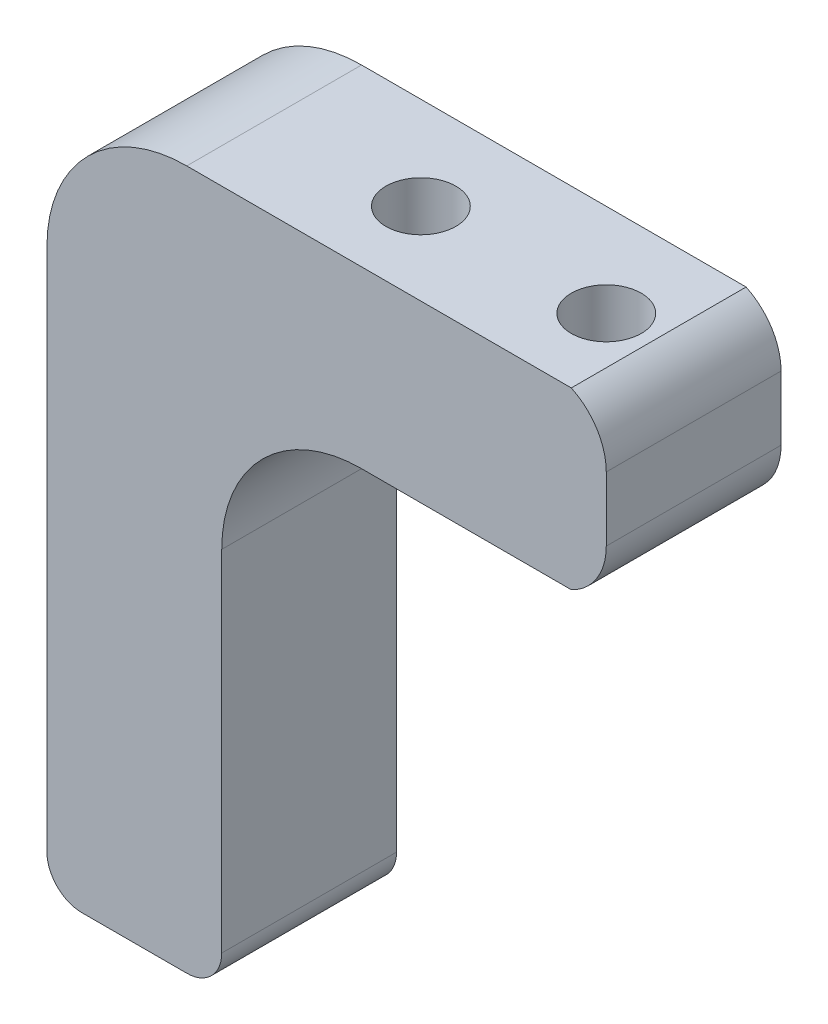
ISO-10303-21;
HEADER;
FILE_DESCRIPTION(('STEP AP214'),'2;1');
FILE_NAME('part.step','',(''),(''),'','','');
FILE_SCHEMA(('AUTOMOTIVE_DESIGN { 1 0 10303 214 1 1 1 1 }'));
ENDSEC;
DATA;
#1=APPLICATION_CONTEXT('core data for automotive mechanical design processes');
#2=APPLICATION_PROTOCOL_DEFINITION('international standard','automotive_design',2000,#1);
#3=PRODUCT_CONTEXT('',#1,'mechanical');
#4=PRODUCT('Part','Part','',(#3));
#5=PRODUCT_RELATED_PRODUCT_CATEGORY('part','',(#4));
#6=PRODUCT_DEFINITION_FORMATION('','',#4);
#7=PRODUCT_DEFINITION_CONTEXT('part definition',#1,'design');
#8=PRODUCT_DEFINITION('design','',#6,#7);
#9=PRODUCT_DEFINITION_SHAPE('','',#8);
#10=(LENGTH_UNIT() NAMED_UNIT(*) SI_UNIT(.MILLI.,.METRE.));
#11=(NAMED_UNIT(*) PLANE_ANGLE_UNIT() SI_UNIT($,.RADIAN.));
#12=(NAMED_UNIT(*) SI_UNIT($,.STERADIAN.) SOLID_ANGLE_UNIT());
#13=UNCERTAINTY_MEASURE_WITH_UNIT(LENGTH_MEASURE(1.E-05),#10,'distance_accuracy_value','');
#14=(GEOMETRIC_REPRESENTATION_CONTEXT(3) GLOBAL_UNCERTAINTY_ASSIGNED_CONTEXT((#13)) GLOBAL_UNIT_ASSIGNED_CONTEXT((#10,
#11,#12)) REPRESENTATION_CONTEXT('',''));
#15=CARTESIAN_POINT('',(0.,0.,0.));
#16=DIRECTION('',(0.,0.,1.));
#17=DIRECTION('',(1.,0.,0.));
#18=AXIS2_PLACEMENT_3D('',#15,#16,#17);
#19=CARTESIAN_POINT('',(18.,22.,10.));
#20=DIRECTION('',(0.,0.,-1.));
#21=DIRECTION('',(-1.,0.,0.));
#22=AXIS2_PLACEMENT_3D('',#19,#20,#21);
#23=CYLINDRICAL_SURFACE('',#22,8.);
#24=DIRECTION('',(0.,0.,-1.));
#25=VECTOR('',#24,1.);
#26=CARTESIAN_POINT('',(18.,30.,10.));
#27=LINE('',#26,#25);
#28=CARTESIAN_POINT('',(18.,30.,3.78626200930005));
#29=VERTEX_POINT('',#28);
#30=CARTESIAN_POINT('',(18.,30.,0.));
#31=VERTEX_POINT('',#30);
#32=EDGE_CURVE('E43',#29,#31,#27,.T.);
#33=ORIENTED_EDGE('',*,*,#32,.F.);
#34=CARTESIAN_POINT('',(18.,30.,3.78626200930005));
#35=CARTESIAN_POINT('',(17.9581541375709,30.0000004037782,3.75031199015781));
#36=CARTESIAN_POINT('',(17.9148387786763,29.999671171087,3.7161106534324));
#37=CARTESIAN_POINT('',(17.8255410886128,29.9982223586818,3.65140516871878));
#38=CARTESIAN_POINT('',(17.7795587091345,29.9971027646475,3.62090108773233));
#39=CARTESIAN_POINT('',(17.6381868953076,29.992367378446,3.53533647613063));
#40=CARTESIAN_POINT('',(17.5392241095997,29.9873758972322,3.48609612306307));
#41=CARTESIAN_POINT('',(17.3347898304661,29.9729547824848,3.40462382730165));
#42=CARTESIAN_POINT('',(17.2293129317956,29.9635214190063,3.37240622732398));
#43=CARTESIAN_POINT('',(17.0150460107856,29.939865783288,3.32576025856803));
#44=CARTESIAN_POINT('',(16.9062571033056,29.9256451066492,3.31132597011048));
#45=CARTESIAN_POINT('',(16.688740021005,29.8925710129595,3.30035923563493));
#46=CARTESIAN_POINT('',(16.5800122092576,29.8737275149771,3.30378877430427));
#47=CARTESIAN_POINT('',(16.3652886146513,29.831966132583,3.3279911018635));
#48=CARTESIAN_POINT('',(16.2592938560138,29.8090467454139,3.34877029795129));
#49=CARTESIAN_POINT('',(16.049513590354,29.7593542083131,3.40767900936154));
#50=CARTESIAN_POINT('',(15.9458948850881,29.7324846083008,3.44631989408963));
#51=CARTESIAN_POINT('',(15.7468164407634,29.6768393315936,3.53983103960354));
#52=CARTESIAN_POINT('',(15.6513584295301,29.6480632535269,3.59470472636909));
#53=CARTESIAN_POINT('',(15.4665700824969,29.5889114266981,3.72217620160287));
#54=CARTESIAN_POINT('',(15.3777269994036,29.558523222656,3.79547606146828));
#55=CARTESIAN_POINT('',(15.2135846844632,29.4995673171941,3.95660105558493));
#56=CARTESIAN_POINT('',(15.1382884534343,29.4710000200335,4.04442939984962));
#57=CARTESIAN_POINT('',(15.0031768712859,29.4178404880318,4.23302392001163));
#58=CARTESIAN_POINT('',(14.9434318052278,29.3932664828079,4.33384585784817));
#59=CARTESIAN_POINT('',(14.8421183334829,29.3505665641479,4.54549450198683));
#60=CARTESIAN_POINT('',(14.8005387536385,29.3324366880102,4.6563150070911));
#61=CARTESIAN_POINT('',(14.7395738536877,29.3055228372001,4.87685631484133));
#62=CARTESIAN_POINT('',(14.7188821591376,29.296191571644,4.98614833399039));
#63=CARTESIAN_POINT('',(14.6959393056221,29.2858324184091,5.20702077451085));
#64=CARTESIAN_POINT('',(14.6936790749875,29.2848004459556,5.31860004302092));
#65=CARTESIAN_POINT('',(14.7071963718525,29.290917639894,5.53258165738326));
#66=CARTESIAN_POINT('',(14.7217292984717,29.2975023428105,5.63508216553269));
#67=CARTESIAN_POINT('',(14.7662024119615,29.3173177596113,5.83600255222788));
#68=CARTESIAN_POINT('',(14.7961438220682,29.3305490011436,5.93442210612775));
#69=CARTESIAN_POINT('',(14.8707942613189,29.3627258794326,6.12596648622863));
#70=CARTESIAN_POINT('',(14.9156898124323,29.3817434148468,6.21900607084032));
#71=CARTESIAN_POINT('',(15.018706605471,29.4239464772951,6.39640278262671));
#72=CARTESIAN_POINT('',(15.0768321020974,29.4471333446658,6.48075710395059));
#73=CARTESIAN_POINT('',(15.2097287041767,29.4979875498677,6.64529335162734));
#74=CARTESIAN_POINT('',(15.2854363698244,29.5258623467681,6.72465503824281));
#75=CARTESIAN_POINT('',(15.4485408958203,29.5827115290047,6.86983554330948));
#76=CARTESIAN_POINT('',(15.5359418259841,29.6116862946562,6.93564962620822));
#77=CARTESIAN_POINT('',(15.7259158697739,29.6706576976109,7.05570841181866));
#78=CARTESIAN_POINT('',(15.8290796955629,29.7006138647113,7.10904223344067));
#79=CARTESIAN_POINT('',(16.0437124936357,29.7579163269707,7.19725637877539));
#80=CARTESIAN_POINT('',(16.1551815299021,29.7852626020196,7.23213656030598));
#81=CARTESIAN_POINT('',(16.3823000137539,29.8355878030593,7.28181821188559));
#82=CARTESIAN_POINT('',(16.4978986796708,29.8586063640472,7.29681037852287));
#83=CARTESIAN_POINT('',(16.7308209392879,29.8995662794725,7.3064000202226));
#84=CARTESIAN_POINT('',(16.84814384082,29.917509615714,7.30100546786239));
#85=CARTESIAN_POINT('',(17.0752384416548,29.9471582761392,7.27033414517417));
#86=CARTESIAN_POINT('',(17.1851058238742,29.959117225013,7.24600409145888));
#87=CARTESIAN_POINT('',(17.399580070966,29.9781625310022,7.17908343032399));
#88=CARTESIAN_POINT('',(17.5041887147987,29.9852505463103,7.13649904517897));
#89=CARTESIAN_POINT('',(17.6753883269194,29.9937279971999,7.04929884771132));
#90=CARTESIAN_POINT('',(17.7441343975952,29.9961788514745,7.00893815896909));
#91=CARTESIAN_POINT('',(17.8762802178445,29.9993178541506,6.92037302840992));
#92=CARTESIAN_POINT('',(17.9396871955432,30.0000084239907,6.87217945871357));
#93=CARTESIAN_POINT('',(18.,30.,6.8203397084982));
#94=B_SPLINE_CURVE_WITH_KNOTS('',3,(#34,#35,#36,#37,#38,#39,#40,#41,#42,#43,#44,#45,#46,#47,#48,
#49,#50,#51,#52,#53,#54,#55,#56,#57,#58,#59,#60,#61,#62,#63,#64,#65,#66,#67,#68,#69,#70,#71,#72,
#73,#74,#75,#76,#77,#78,#79,#80,#81,#82,#83,#84,#85,#86,#87,#88,#89,#90,#91,#92,#93),
.UNSPECIFIED.,.F.,.F.,(4,2,2,2,2,2,2,2,2,2,2,2,2,2,2,2,2,2,2,2,2,2,2,2,2,2,2,2,2,4),(0.,
0.165404618031273,0.330812233080998,0.661047411420463,0.991560391283093,1.32196332078026,
1.65166342034593,1.98148533145803,2.32139787396724,2.66138220724431,3.01708301990866,
3.37286252854663,3.73022314325104,4.08736362371171,4.4204464535295,4.75336533545012,
5.06311077462391,5.37288080741128,5.68666906059636,6.00055836985133,6.33859572442004,
6.67675103973497,7.03484333027455,7.39293837981335,7.74757439540581,8.10207173883505,
8.43990186874776,8.77761693542808,9.01633033375412,9.25471518146875),.UNSPECIFIED.);
#95=CARTESIAN_POINT('',(18.,30.,6.8203397084982));
#96=VERTEX_POINT('',#95);
#97=EDGE_CURVE('E57',#29,#96,#94,.T.);
#98=ORIENTED_EDGE('',*,*,#97,.T.);
#99=CARTESIAN_POINT('',(18.,30.,10.));
#100=VERTEX_POINT('',#99);
#101=EDGE_CURVE('E11',#100,#96,#27,.T.);
#102=ORIENTED_EDGE('',*,*,#101,.F.);
#103=CARTESIAN_POINT('',(18.,22.,10.));
#104=DIRECTION('',(0.,0.,-1.));
#105=DIRECTION('',(1.,0.,0.));
#106=AXIS2_PLACEMENT_3D('',#103,#104,#105);
#107=CIRCLE('',#106,8.);
#108=CARTESIAN_POINT('',(10.,22.,10.));
#109=VERTEX_POINT('',#108);
#110=EDGE_CURVE('E171',#109,#100,#107,.T.);
#111=ORIENTED_EDGE('',*,*,#110,.F.);
#112=DIRECTION('',(0.,0.,-1.));
#113=VECTOR('',#112,1.);
#114=CARTESIAN_POINT('',(10.,22.,10.));
#115=LINE('',#114,#113);
#116=CARTESIAN_POINT('',(10.,22.,0.));
#117=VERTEX_POINT('',#116);
#118=EDGE_CURVE('E172',#109,#117,#115,.T.);
#119=ORIENTED_EDGE('',*,*,#118,.T.);
#120=CARTESIAN_POINT('',(18.,22.,0.));
#121=DIRECTION('',(0.,0.,-1.));
#122=DIRECTION('',(1.,0.,0.));
#123=AXIS2_PLACEMENT_3D('',#120,#121,#122);
#124=CIRCLE('',#123,8.);
#125=EDGE_CURVE('E158',#117,#31,#124,.T.);
#126=ORIENTED_EDGE('',*,*,#125,.T.);
#127=EDGE_LOOP('',(#33,#98,#102,#111,#119,#126));
#128=FACE_BOUND('',#127,.T.);
#129=ADVANCED_FACE('F35',(#128),#23,.F.);
#130=CARTESIAN_POINT('',(18.,30.,10.));
#131=DIRECTION('',(0.,1.,0.));
#132=DIRECTION('',(-1.,0.,0.));
#133=AXIS2_PLACEMENT_3D('',#130,#131,#132);
#134=PLANE('',#133);
#135=CARTESIAN_POINT('',(27.3033008588991,30.,5.30330085889912));
#136=DIRECTION('',(0.,1.,0.));
#137=DIRECTION('',(-1.,0.,0.));
#138=AXIS2_PLACEMENT_3D('',#135,#136,#137);
#139=CIRCLE('',#138,2.00000000000002);
#140=CARTESIAN_POINT('',(25.3033008588991,30.,5.30330085889912));
#141=VERTEX_POINT('',#140);
#142=EDGE_CURVE('E282',#141,#141,#139,.T.);
#143=ORIENTED_EDGE('',*,*,#142,.T.);
#144=EDGE_LOOP('',(#143));
#145=FACE_BOUND('',#144,.T.);
#146=DIRECTION('',(1.,0.,0.));
#147=VECTOR('',#146,1.);
#148=CARTESIAN_POINT('',(18.,30.,0.));
#149=LINE('',#148,#147);
#150=CARTESIAN_POINT('',(30.,30.,0.));
#151=VERTEX_POINT('',#150);
#152=EDGE_CURVE('E153',#31,#151,#149,.T.);
#153=ORIENTED_EDGE('',*,*,#152,.T.);
#154=DIRECTION('',(0.,0.,1.));
#155=VECTOR('',#154,1.);
#156=CARTESIAN_POINT('',(30.,30.,0.));
#157=LINE('',#156,#155);
#158=CARTESIAN_POINT('',(30.,30.,10.));
#159=VERTEX_POINT('',#158);
#160=EDGE_CURVE('E290',#151,#159,#157,.T.);
#161=ORIENTED_EDGE('',*,*,#160,.T.);
#162=DIRECTION('',(1.,0.,0.));
#163=VECTOR('',#162,1.);
#164=CARTESIAN_POINT('',(18.,30.,10.));
#165=LINE('',#164,#163);
#166=EDGE_CURVE('E221',#100,#159,#165,.T.);
#167=ORIENTED_EDGE('',*,*,#166,.F.);
#168=ORIENTED_EDGE('',*,*,#101,.T.);
#169=CARTESIAN_POINT('',(16.6966991411009,30.,5.30330085889912));
#170=DIRECTION('',(0.,1.,0.));
#171=DIRECTION('',(-1.,0.,0.));
#172=AXIS2_PLACEMENT_3D('',#169,#170,#171);
#173=CIRCLE('',#172,2.);
#174=EDGE_CURVE('E198',#96,#29,#173,.T.);
#175=ORIENTED_EDGE('',*,*,#174,.T.);
#176=ORIENTED_EDGE('',*,*,#32,.T.);
#177=EDGE_LOOP('',(#153,#161,#167,#168,#175,#176));
#178=FACE_BOUND('',#177,.T.);
#179=ADVANCED_FACE('F196',(#145,#178),#134,.F.);
#180=CARTESIAN_POINT('',(8.,40.,10.));
#181=DIRECTION('',(0.,-1.,0.));
#182=DIRECTION('',(1.,0.,0.));
#183=AXIS2_PLACEMENT_3D('',#180,#181,#182);
#184=PLANE('',#183);
#185=CARTESIAN_POINT('',(16.6966991411009,40.,5.30330085889912));
#186=DIRECTION('',(0.,1.,0.));
#187=DIRECTION('',(-1.,0.,0.));
#188=AXIS2_PLACEMENT_3D('',#185,#186,#187);
#189=CIRCLE('',#188,2.);
#190=CARTESIAN_POINT('',(14.6966991411009,40.,5.30330085889912));
#191=VERTEX_POINT('',#190);
#192=EDGE_CURVE('E284',#191,#191,#189,.T.);
#193=ORIENTED_EDGE('',*,*,#192,.F.);
#194=EDGE_LOOP('',(#193));
#195=FACE_BOUND('',#194,.T.);
#196=CARTESIAN_POINT('',(27.3033008588991,40.,5.30330085889912));
#197=DIRECTION('',(0.,1.,0.));
#198=DIRECTION('',(-1.,0.,0.));
#199=AXIS2_PLACEMENT_3D('',#196,#197,#198);
#200=CIRCLE('',#199,2.00000000000002);
#201=CARTESIAN_POINT('',(25.3033008588991,40.,5.30330085889912));
#202=VERTEX_POINT('',#201);
#203=EDGE_CURVE('E286',#202,#202,#200,.T.);
#204=ORIENTED_EDGE('',*,*,#203,.F.);
#205=EDGE_LOOP('',(#204));
#206=FACE_BOUND('',#205,.T.);
#207=DIRECTION('',(-1.,0.,0.));
#208=VECTOR('',#207,1.);
#209=CARTESIAN_POINT('',(8.,40.,10.));
#210=LINE('',#209,#208);
#211=CARTESIAN_POINT('',(30.,40.,10.));
#212=VERTEX_POINT('',#211);
#213=CARTESIAN_POINT('',(8.,40.,10.));
#214=VERTEX_POINT('',#213);
#215=EDGE_CURVE('E146',#212,#214,#210,.T.);
#216=ORIENTED_EDGE('',*,*,#215,.F.);
#217=DIRECTION('',(0.,0.,1.));
#218=VECTOR('',#217,1.);
#219=CARTESIAN_POINT('',(30.,40.,0.));
#220=LINE('',#219,#218);
#221=CARTESIAN_POINT('',(30.,40.,0.));
#222=VERTEX_POINT('',#221);
#223=EDGE_CURVE('E133',#222,#212,#220,.T.);
#224=ORIENTED_EDGE('',*,*,#223,.F.);
#225=DIRECTION('',(-1.,0.,0.));
#226=VECTOR('',#225,1.);
#227=CARTESIAN_POINT('',(8.,40.,0.));
#228=LINE('',#227,#226);
#229=CARTESIAN_POINT('',(8.,40.,0.));
#230=VERTEX_POINT('',#229);
#231=EDGE_CURVE('E144',#222,#230,#228,.T.);
#232=ORIENTED_EDGE('',*,*,#231,.T.);
#233=DIRECTION('',(0.,0.,-1.));
#234=VECTOR('',#233,1.);
#235=CARTESIAN_POINT('',(8.,40.,10.));
#236=LINE('',#235,#234);
#237=EDGE_CURVE('E190',#214,#230,#236,.T.);
#238=ORIENTED_EDGE('',*,*,#237,.F.);
#239=EDGE_LOOP('',(#216,#224,#232,#238));
#240=FACE_BOUND('',#239,.T.);
#241=ADVANCED_FACE('F142',(#195,#206,#240),#184,.F.);
#242=CARTESIAN_POINT('',(8.,32.,10.));
#243=DIRECTION('',(0.,0.,-1.));
#244=DIRECTION('',(-1.,0.,0.));
#245=AXIS2_PLACEMENT_3D('',#242,#243,#244);
#246=CYLINDRICAL_SURFACE('',#245,8.);
#247=CARTESIAN_POINT('',(8.,32.,0.));
#248=DIRECTION('',(0.,0.,1.));
#249=DIRECTION('',(-1.,0.,0.));
#250=AXIS2_PLACEMENT_3D('',#247,#248,#249);
#251=CIRCLE('',#250,8.);
#252=CARTESIAN_POINT('',(0.,32.,0.));
#253=VERTEX_POINT('',#252);
#254=EDGE_CURVE('E152',#230,#253,#251,.T.);
#255=ORIENTED_EDGE('',*,*,#254,.T.);
#256=DIRECTION('',(0.,0.,-1.));
#257=VECTOR('',#256,1.);
#258=CARTESIAN_POINT('',(0.,32.,10.));
#259=LINE('',#258,#257);
#260=CARTESIAN_POINT('',(0.,32.,10.));
#261=VERTEX_POINT('',#260);
#262=EDGE_CURVE('E188',#261,#253,#259,.T.);
#263=ORIENTED_EDGE('',*,*,#262,.F.);
#264=CARTESIAN_POINT('',(8.,32.,10.));
#265=DIRECTION('',(0.,0.,1.));
#266=DIRECTION('',(-1.,0.,0.));
#267=AXIS2_PLACEMENT_3D('',#264,#265,#266);
#268=CIRCLE('',#267,8.);
#269=EDGE_CURVE('E218',#214,#261,#268,.T.);
#270=ORIENTED_EDGE('',*,*,#269,.F.);
#271=ORIENTED_EDGE('',*,*,#237,.T.);
#272=EDGE_LOOP('',(#255,#263,#270,#271));
#273=FACE_BOUND('',#272,.T.);
#274=ADVANCED_FACE('F269',(#273),#246,.T.);
#275=CARTESIAN_POINT('',(0.,32.,10.));
#276=DIRECTION('',(1.,0.,0.));
#277=DIRECTION('',(0.,1.,0.));
#278=AXIS2_PLACEMENT_3D('',#275,#276,#277);
#279=PLANE('',#278);
#280=DIRECTION('',(0.,-1.,0.));
#281=VECTOR('',#280,1.);
#282=CARTESIAN_POINT('',(0.,32.,0.));
#283=LINE('',#282,#281);
#284=CARTESIAN_POINT('',(0.,2.,0.));
#285=VERTEX_POINT('',#284);
#286=EDGE_CURVE('E155',#253,#285,#283,.T.);
#287=ORIENTED_EDGE('',*,*,#286,.T.);
#288=DIRECTION('',(0.,0.,-1.));
#289=VECTOR('',#288,1.);
#290=CARTESIAN_POINT('',(0.,2.,10.));
#291=LINE('',#290,#289);
#292=CARTESIAN_POINT('',(0.,2.,10.));
#293=VERTEX_POINT('',#292);
#294=EDGE_CURVE('E185',#293,#285,#291,.T.);
#295=ORIENTED_EDGE('',*,*,#294,.F.);
#296=DIRECTION('',(0.,-1.,0.));
#297=VECTOR('',#296,1.);
#298=CARTESIAN_POINT('',(0.,32.,10.));
#299=LINE('',#298,#297);
#300=EDGE_CURVE('E216',#261,#293,#299,.T.);
#301=ORIENTED_EDGE('',*,*,#300,.F.);
#302=ORIENTED_EDGE('',*,*,#262,.T.);
#303=EDGE_LOOP('',(#287,#295,#301,#302));
#304=FACE_BOUND('',#303,.T.);
#305=ADVANCED_FACE('F265',(#304),#279,.F.);
#306=CARTESIAN_POINT('',(2.,2.,10.));
#307=DIRECTION('',(0.,0.,-1.));
#308=DIRECTION('',(-1.,0.,0.));
#309=AXIS2_PLACEMENT_3D('',#306,#307,#308);
#310=CYLINDRICAL_SURFACE('',#309,2.);
#311=CARTESIAN_POINT('',(2.,2.,0.));
#312=DIRECTION('',(0.,0.,1.));
#313=DIRECTION('',(-1.,0.,0.));
#314=AXIS2_PLACEMENT_3D('',#311,#312,#313);
#315=CIRCLE('',#314,2.);
#316=CARTESIAN_POINT('',(2.,0.,0.));
#317=VERTEX_POINT('',#316);
#318=EDGE_CURVE('E163',#285,#317,#315,.T.);
#319=ORIENTED_EDGE('',*,*,#318,.T.);
#320=DIRECTION('',(0.,0.,-1.));
#321=VECTOR('',#320,1.);
#322=CARTESIAN_POINT('',(2.,0.,10.));
#323=LINE('',#322,#321);
#324=CARTESIAN_POINT('',(2.,0.,10.));
#325=VERTEX_POINT('',#324);
#326=EDGE_CURVE('E182',#325,#317,#323,.T.);
#327=ORIENTED_EDGE('',*,*,#326,.F.);
#328=CARTESIAN_POINT('',(2.,2.,10.));
#329=DIRECTION('',(0.,0.,1.));
#330=DIRECTION('',(-1.,0.,0.));
#331=AXIS2_PLACEMENT_3D('',#328,#329,#330);
#332=CIRCLE('',#331,2.);
#333=EDGE_CURVE('E214',#293,#325,#332,.T.);
#334=ORIENTED_EDGE('',*,*,#333,.F.);
#335=ORIENTED_EDGE('',*,*,#294,.T.);
#336=EDGE_LOOP('',(#319,#327,#334,#335));
#337=FACE_BOUND('',#336,.T.);
#338=ADVANCED_FACE('F261',(#337),#310,.T.);
#339=CARTESIAN_POINT('',(2.,0.,10.));
#340=DIRECTION('',(0.,1.,0.));
#341=DIRECTION('',(-1.,0.,0.));
#342=AXIS2_PLACEMENT_3D('',#339,#340,#341);
#343=PLANE('',#342);
#344=DIRECTION('',(1.,0.,0.));
#345=VECTOR('',#344,1.);
#346=CARTESIAN_POINT('',(2.,0.,0.));
#347=LINE('',#346,#345);
#348=CARTESIAN_POINT('',(8.,0.,0.));
#349=VERTEX_POINT('',#348);
#350=EDGE_CURVE('E165',#317,#349,#347,.T.);
#351=ORIENTED_EDGE('',*,*,#350,.T.);
#352=DIRECTION('',(0.,0.,-1.));
#353=VECTOR('',#352,1.);
#354=CARTESIAN_POINT('',(8.,0.,10.));
#355=LINE('',#354,#353);
#356=CARTESIAN_POINT('',(8.,0.,10.));
#357=VERTEX_POINT('',#356);
#358=EDGE_CURVE('E179',#357,#349,#355,.T.);
#359=ORIENTED_EDGE('',*,*,#358,.F.);
#360=DIRECTION('',(1.,0.,0.));
#361=VECTOR('',#360,1.);
#362=CARTESIAN_POINT('',(2.,0.,10.));
#363=LINE('',#362,#361);
#364=EDGE_CURVE('E212',#325,#357,#363,.T.);
#365=ORIENTED_EDGE('',*,*,#364,.F.);
#366=ORIENTED_EDGE('',*,*,#326,.T.);
#367=EDGE_LOOP('',(#351,#359,#365,#366));
#368=FACE_BOUND('',#367,.T.);
#369=ADVANCED_FACE('F257',(#368),#343,.F.);
#370=CARTESIAN_POINT('',(8.,2.,10.));
#371=DIRECTION('',(0.,0.,-1.));
#372=DIRECTION('',(-1.,0.,0.));
#373=AXIS2_PLACEMENT_3D('',#370,#371,#372);
#374=CYLINDRICAL_SURFACE('',#373,2.);
#375=CARTESIAN_POINT('',(8.,2.,0.));
#376=DIRECTION('',(0.,0.,1.));
#377=DIRECTION('',(1.,0.,0.));
#378=AXIS2_PLACEMENT_3D('',#375,#376,#377);
#379=CIRCLE('',#378,2.);
#380=CARTESIAN_POINT('',(10.,2.,0.));
#381=VERTEX_POINT('',#380);
#382=EDGE_CURVE('E167',#349,#381,#379,.T.);
#383=ORIENTED_EDGE('',*,*,#382,.T.);
#384=DIRECTION('',(0.,0.,-1.));
#385=VECTOR('',#384,1.);
#386=CARTESIAN_POINT('',(10.,2.,10.));
#387=LINE('',#386,#385);
#388=CARTESIAN_POINT('',(10.,2.,10.));
#389=VERTEX_POINT('',#388);
#390=EDGE_CURVE('E175',#389,#381,#387,.T.);
#391=ORIENTED_EDGE('',*,*,#390,.F.);
#392=CARTESIAN_POINT('',(8.,2.,10.));
#393=DIRECTION('',(0.,0.,1.));
#394=DIRECTION('',(1.,0.,0.));
#395=AXIS2_PLACEMENT_3D('',#392,#393,#394);
#396=CIRCLE('',#395,2.);
#397=EDGE_CURVE('E210',#357,#389,#396,.T.);
#398=ORIENTED_EDGE('',*,*,#397,.F.);
#399=ORIENTED_EDGE('',*,*,#358,.T.);
#400=EDGE_LOOP('',(#383,#391,#398,#399));
#401=FACE_BOUND('',#400,.T.);
#402=ADVANCED_FACE('F253',(#401),#374,.T.);
#403=CARTESIAN_POINT('',(10.,2.,10.));
#404=DIRECTION('',(-1.,0.,0.));
#405=DIRECTION('',(0.,-1.,0.));
#406=AXIS2_PLACEMENT_3D('',#403,#404,#405);
#407=PLANE('',#406);
#408=DIRECTION('',(0.,1.,0.));
#409=VECTOR('',#408,1.);
#410=CARTESIAN_POINT('',(10.,2.,0.));
#411=LINE('',#410,#409);
#412=EDGE_CURVE('E169',#381,#117,#411,.T.);
#413=ORIENTED_EDGE('',*,*,#412,.T.);
#414=ORIENTED_EDGE('',*,*,#118,.F.);
#415=DIRECTION('',(0.,1.,0.));
#416=VECTOR('',#415,1.);
#417=CARTESIAN_POINT('',(10.,2.,10.));
#418=LINE('',#417,#416);
#419=EDGE_CURVE('E176',#389,#109,#418,.T.);
#420=ORIENTED_EDGE('',*,*,#419,.F.);
#421=ORIENTED_EDGE('',*,*,#390,.T.);
#422=EDGE_LOOP('',(#413,#414,#420,#421));
#423=FACE_BOUND('',#422,.T.);
#424=ADVANCED_FACE('F247',(#423),#407,.F.);
#425=CARTESIAN_POINT('',(18.,22.,10.));
#426=DIRECTION('',(0.,0.,1.));
#427=DIRECTION('',(1.,0.,0.));
#428=AXIS2_PLACEMENT_3D('',#425,#426,#427);
#429=PLANE('',#428);
#430=CARTESIAN_POINT('',(28.5,33.1622776601684,10.));
#431=DIRECTION('',(0.,0.,-1.));
#432=DIRECTION('',(1.,0.,0.));
#433=AXIS2_PLACEMENT_3D('',#430,#431,#432);
#434=CIRCLE('',#433,3.5);
#435=CARTESIAN_POINT('',(32.,33.1622776601684,10.));
#436=VERTEX_POINT('',#435);
#437=EDGE_CURVE('E138',#436,#159,#434,.T.);
#438=ORIENTED_EDGE('',*,*,#437,.F.);
#439=DIRECTION('',(0.,-1.,0.));
#440=VECTOR('',#439,1.);
#441=CARTESIAN_POINT('',(32.,36.8377223398316,10.));
#442=LINE('',#441,#440);
#443=CARTESIAN_POINT('',(32.,36.8377223398316,10.));
#444=VERTEX_POINT('',#443);
#445=EDGE_CURVE('E297',#444,#436,#442,.T.);
#446=ORIENTED_EDGE('',*,*,#445,.F.);
#447=CARTESIAN_POINT('',(28.5,36.8377223398316,10.));
#448=DIRECTION('',(0.,0.,-1.));
#449=DIRECTION('',(1.,0.,0.));
#450=AXIS2_PLACEMENT_3D('',#447,#448,#449);
#451=CIRCLE('',#450,3.5);
#452=EDGE_CURVE('E300',#212,#444,#451,.T.);
#453=ORIENTED_EDGE('',*,*,#452,.F.);
#454=ORIENTED_EDGE('',*,*,#215,.T.);
#455=ORIENTED_EDGE('',*,*,#269,.T.);
#456=ORIENTED_EDGE('',*,*,#300,.T.);
#457=ORIENTED_EDGE('',*,*,#333,.T.);
#458=ORIENTED_EDGE('',*,*,#364,.T.);
#459=ORIENTED_EDGE('',*,*,#397,.T.);
#460=ORIENTED_EDGE('',*,*,#419,.T.);
#461=ORIENTED_EDGE('',*,*,#110,.T.);
#462=ORIENTED_EDGE('',*,*,#166,.T.);
#463=EDGE_LOOP('',(#438,#446,#453,#454,#455,#456,#457,#458,#459,#460,#461,#462));
#464=FACE_BOUND('',#463,.T.);
#465=ADVANCED_FACE('F244',(#464),#429,.T.);
#466=CARTESIAN_POINT('',(18.,22.,0.));
#467=DIRECTION('',(0.,0.,1.));
#468=DIRECTION('',(1.,0.,0.));
#469=AXIS2_PLACEMENT_3D('',#466,#467,#468);
#470=PLANE('',#469);
#471=DIRECTION('',(0.,-1.,0.));
#472=VECTOR('',#471,1.);
#473=CARTESIAN_POINT('',(32.,36.8377223398316,0.));
#474=LINE('',#473,#472);
#475=CARTESIAN_POINT('',(32.,36.8377223398316,0.));
#476=VERTEX_POINT('',#475);
#477=CARTESIAN_POINT('',(32.,33.1622776601684,0.));
#478=VERTEX_POINT('',#477);
#479=EDGE_CURVE('E50',#476,#478,#474,.T.);
#480=ORIENTED_EDGE('',*,*,#479,.T.);
#481=CARTESIAN_POINT('',(28.5,33.1622776601684,0.));
#482=DIRECTION('',(0.,0.,-1.));
#483=DIRECTION('',(1.,0.,0.));
#484=AXIS2_PLACEMENT_3D('',#481,#482,#483);
#485=CIRCLE('',#484,3.5);
#486=EDGE_CURVE('E147',#478,#151,#485,.T.);
#487=ORIENTED_EDGE('',*,*,#486,.T.);
#488=ORIENTED_EDGE('',*,*,#152,.F.);
#489=ORIENTED_EDGE('',*,*,#125,.F.);
#490=ORIENTED_EDGE('',*,*,#412,.F.);
#491=ORIENTED_EDGE('',*,*,#382,.F.);
#492=ORIENTED_EDGE('',*,*,#350,.F.);
#493=ORIENTED_EDGE('',*,*,#318,.F.);
#494=ORIENTED_EDGE('',*,*,#286,.F.);
#495=ORIENTED_EDGE('',*,*,#254,.F.);
#496=ORIENTED_EDGE('',*,*,#231,.F.);
#497=CARTESIAN_POINT('',(28.5,36.8377223398316,0.));
#498=DIRECTION('',(0.,0.,-1.));
#499=DIRECTION('',(1.,0.,0.));
#500=AXIS2_PLACEMENT_3D('',#497,#498,#499);
#501=CIRCLE('',#500,3.5);
#502=EDGE_CURVE('E129',#222,#476,#501,.T.);
#503=ORIENTED_EDGE('',*,*,#502,.T.);
#504=EDGE_LOOP('',(#480,#487,#488,#489,#490,#491,#492,#493,#494,#495,#496,#503));
#505=FACE_BOUND('',#504,.T.);
#506=ADVANCED_FACE('F150',(#505),#470,.F.);
#507=CARTESIAN_POINT('',(27.3033008588991,9.99999999999999,5.30330085889912));
#508=DIRECTION('',(0.,1.,0.));
#509=DIRECTION('',(-1.,0.,0.));
#510=AXIS2_PLACEMENT_3D('',#507,#508,#509);
#511=CYLINDRICAL_SURFACE('',#510,2.00000000000002);
#512=ORIENTED_EDGE('',*,*,#203,.T.);
#513=EDGE_LOOP('',(#512));
#514=FACE_BOUND('',#513,.T.);
#515=ORIENTED_EDGE('',*,*,#142,.F.);
#516=EDGE_LOOP('',(#515));
#517=FACE_BOUND('',#516,.T.);
#518=ADVANCED_FACE('F238',(#514,#517),#511,.F.);
#519=CARTESIAN_POINT('',(16.6966991411009,9.99999999999999,5.30330085889912));
#520=DIRECTION('',(0.,1.,0.));
#521=DIRECTION('',(-1.,0.,0.));
#522=AXIS2_PLACEMENT_3D('',#519,#520,#521);
#523=CYLINDRICAL_SURFACE('',#522,2.);
#524=ORIENTED_EDGE('',*,*,#192,.T.);
#525=EDGE_LOOP('',(#524));
#526=FACE_BOUND('',#525,.T.);
#527=ORIENTED_EDGE('',*,*,#174,.F.);
#528=ORIENTED_EDGE('',*,*,#97,.F.);
#529=EDGE_LOOP('',(#527,#528));
#530=FACE_BOUND('',#529,.T.);
#531=ADVANCED_FACE('F232',(#526,#530),#523,.F.);
#532=CARTESIAN_POINT('',(28.5,33.1622776601684,0.));
#533=DIRECTION('',(0.,0.,1.));
#534=DIRECTION('',(1.,0.,0.));
#535=AXIS2_PLACEMENT_3D('',#532,#533,#534);
#536=CYLINDRICAL_SURFACE('',#535,3.5);
#537=ORIENTED_EDGE('',*,*,#437,.T.);
#538=ORIENTED_EDGE('',*,*,#160,.F.);
#539=ORIENTED_EDGE('',*,*,#486,.F.);
#540=DIRECTION('',(0.,0.,1.));
#541=VECTOR('',#540,1.);
#542=CARTESIAN_POINT('',(32.,33.1622776601684,0.));
#543=LINE('',#542,#541);
#544=EDGE_CURVE('E293',#478,#436,#543,.T.);
#545=ORIENTED_EDGE('',*,*,#544,.T.);
#546=EDGE_LOOP('',(#537,#538,#539,#545));
#547=FACE_BOUND('',#546,.T.);
#548=ADVANCED_FACE('F237',(#547),#536,.T.);
#549=CARTESIAN_POINT('',(32.,36.8377223398316,0.));
#550=DIRECTION('',(-1.,0.,0.));
#551=DIRECTION('',(0.,-1.,0.));
#552=AXIS2_PLACEMENT_3D('',#549,#550,#551);
#553=PLANE('',#552);
#554=ORIENTED_EDGE('',*,*,#445,.T.);
#555=ORIENTED_EDGE('',*,*,#544,.F.);
#556=ORIENTED_EDGE('',*,*,#479,.F.);
#557=DIRECTION('',(0.,0.,1.));
#558=VECTOR('',#557,1.);
#559=CARTESIAN_POINT('',(32.,36.8377223398316,0.));
#560=LINE('',#559,#558);
#561=EDGE_CURVE('E135',#476,#444,#560,.T.);
#562=ORIENTED_EDGE('',*,*,#561,.T.);
#563=EDGE_LOOP('',(#554,#555,#556,#562));
#564=FACE_BOUND('',#563,.T.);
#565=ADVANCED_FACE('F305',(#564),#553,.F.);
#566=CARTESIAN_POINT('',(28.5,36.8377223398316,0.));
#567=DIRECTION('',(0.,0.,1.));
#568=DIRECTION('',(1.,0.,0.));
#569=AXIS2_PLACEMENT_3D('',#566,#567,#568);
#570=CYLINDRICAL_SURFACE('',#569,3.5);
#571=ORIENTED_EDGE('',*,*,#452,.T.);
#572=ORIENTED_EDGE('',*,*,#561,.F.);
#573=ORIENTED_EDGE('',*,*,#502,.F.);
#574=ORIENTED_EDGE('',*,*,#223,.T.);
#575=EDGE_LOOP('',(#571,#572,#573,#574));
#576=FACE_BOUND('',#575,.T.);
#577=ADVANCED_FACE('F132',(#576),#570,.T.);
#578=CLOSED_SHELL('',(#129,#179,#241,#274,#305,#338,#369,#402,#424,#465,#506,#518,#531,#548,
#565,#577));
#579=MANIFOLD_SOLID_BREP('B2',#578);
#580=ADVANCED_BREP_SHAPE_REPRESENTATION('',(#18,#579),#14);
#581=SHAPE_DEFINITION_REPRESENTATION(#9,#580);
ENDSEC;
END-ISO-10303-21;
